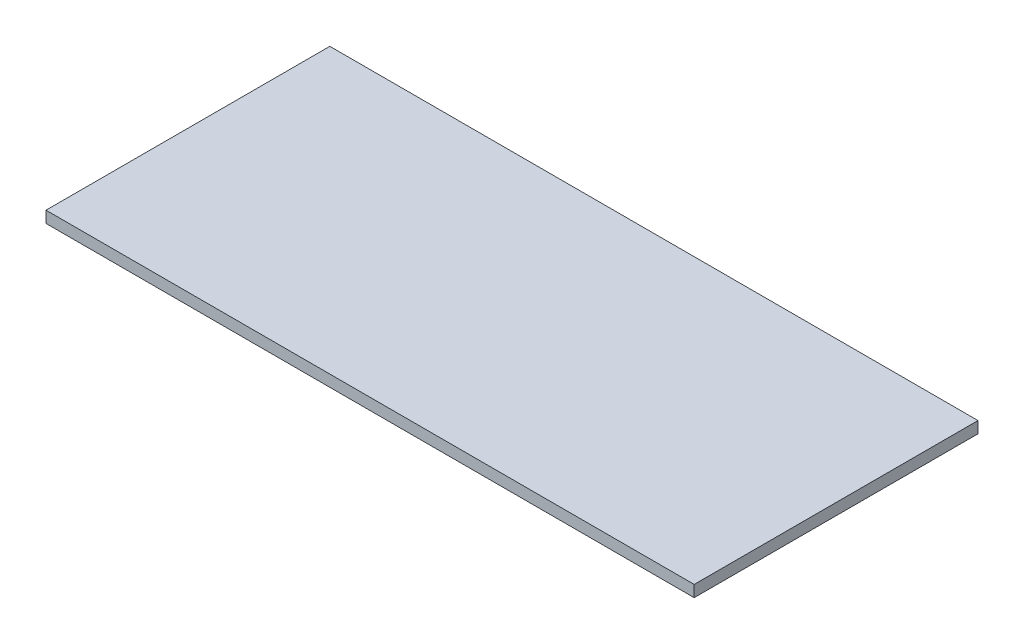
ISO-10303-21;
HEADER;
FILE_DESCRIPTION(('STEP AP214'),'2;1');
FILE_NAME('part.step','',(''),(''),'','','');
FILE_SCHEMA(('AUTOMOTIVE_DESIGN { 1 0 10303 214 1 1 1 1 }'));
ENDSEC;
DATA;
#1=APPLICATION_CONTEXT('core data for automotive mechanical design processes');
#2=APPLICATION_PROTOCOL_DEFINITION('international standard','automotive_design',2000,#1);
#3=PRODUCT_CONTEXT('',#1,'mechanical');
#4=PRODUCT('Part','Part','',(#3));
#5=PRODUCT_RELATED_PRODUCT_CATEGORY('part','',(#4));
#6=PRODUCT_DEFINITION_FORMATION('','',#4);
#7=PRODUCT_DEFINITION_CONTEXT('part definition',#1,'design');
#8=PRODUCT_DEFINITION('design','',#6,#7);
#9=PRODUCT_DEFINITION_SHAPE('','',#8);
#10=(LENGTH_UNIT() NAMED_UNIT(*) SI_UNIT(.MILLI.,.METRE.));
#11=(NAMED_UNIT(*) PLANE_ANGLE_UNIT() SI_UNIT($,.RADIAN.));
#12=(NAMED_UNIT(*) SI_UNIT($,.STERADIAN.) SOLID_ANGLE_UNIT());
#13=UNCERTAINTY_MEASURE_WITH_UNIT(LENGTH_MEASURE(1.E-05),#10,'distance_accuracy_value','');
#14=(GEOMETRIC_REPRESENTATION_CONTEXT(3) GLOBAL_UNCERTAINTY_ASSIGNED_CONTEXT((#13)) GLOBAL_UNIT_ASSIGNED_CONTEXT((#10,
#11,#12)) REPRESENTATION_CONTEXT('',''));
#15=CARTESIAN_POINT('',(0.,0.,0.));
#16=DIRECTION('',(0.,0.,1.));
#17=DIRECTION('',(1.,0.,0.));
#18=AXIS2_PLACEMENT_3D('',#15,#16,#17);
#19=CARTESIAN_POINT('',(0.,1.5,0.));
#20=DIRECTION('',(1.,0.,0.));
#21=DIRECTION('',(0.,0.,-1.));
#22=AXIS2_PLACEMENT_3D('',#19,#20,#21);
#23=PLANE('',#22);
#24=DIRECTION('',(0.,0.,1.));
#25=VECTOR('',#24,1.);
#26=CARTESIAN_POINT('',(0.,0.,0.));
#27=LINE('',#26,#25);
#28=CARTESIAN_POINT('',(0.,0.,0.));
#29=VERTEX_POINT('',#28);
#30=CARTESIAN_POINT('',(0.,0.,37.));
#31=VERTEX_POINT('',#30);
#32=EDGE_CURVE('E102',#29,#31,#27,.T.);
#33=ORIENTED_EDGE('',*,*,#32,.T.);
#34=DIRECTION('',(0.,-1.,0.));
#35=VECTOR('',#34,1.);
#36=CARTESIAN_POINT('',(0.,1.5,37.));
#37=LINE('',#36,#35);
#38=CARTESIAN_POINT('',(0.,1.5,37.));
#39=VERTEX_POINT('',#38);
#40=EDGE_CURVE('E11',#39,#31,#37,.T.);
#41=ORIENTED_EDGE('',*,*,#40,.F.);
#42=DIRECTION('',(0.,0.,1.));
#43=VECTOR('',#42,1.);
#44=CARTESIAN_POINT('',(0.,1.5,0.));
#45=LINE('',#44,#43);
#46=CARTESIAN_POINT('',(0.,1.5,0.));
#47=VERTEX_POINT('',#46);
#48=EDGE_CURVE('E90',#47,#39,#45,.T.);
#49=ORIENTED_EDGE('',*,*,#48,.F.);
#50=DIRECTION('',(0.,-1.,0.));
#51=VECTOR('',#50,1.);
#52=CARTESIAN_POINT('',(0.,1.5,0.));
#53=LINE('',#52,#51);
#54=EDGE_CURVE('E98',#47,#29,#53,.T.);
#55=ORIENTED_EDGE('',*,*,#54,.T.);
#56=EDGE_LOOP('',(#33,#41,#49,#55));
#57=FACE_BOUND('',#56,.T.);
#58=ADVANCED_FACE('F39',(#57),#23,.F.);
#59=CARTESIAN_POINT('',(0.,1.5,37.));
#60=DIRECTION('',(0.,0.,-1.));
#61=DIRECTION('',(-1.,0.,0.));
#62=AXIS2_PLACEMENT_3D('',#59,#60,#61);
#63=PLANE('',#62);
#64=DIRECTION('',(1.,0.,0.));
#65=VECTOR('',#64,1.);
#66=CARTESIAN_POINT('',(0.,0.,37.));
#67=LINE('',#66,#65);
#68=CARTESIAN_POINT('',(84.5,0.,37.));
#69=VERTEX_POINT('',#68);
#70=EDGE_CURVE('E94',#31,#69,#67,.T.);
#71=ORIENTED_EDGE('',*,*,#70,.T.);
#72=DIRECTION('',(0.,-1.,0.));
#73=VECTOR('',#72,1.);
#74=CARTESIAN_POINT('',(84.5,1.5,37.));
#75=LINE('',#74,#73);
#76=CARTESIAN_POINT('',(84.5,1.5,37.));
#77=VERTEX_POINT('',#76);
#78=EDGE_CURVE('E47',#77,#69,#75,.T.);
#79=ORIENTED_EDGE('',*,*,#78,.F.);
#80=DIRECTION('',(1.,0.,0.));
#81=VECTOR('',#80,1.);
#82=CARTESIAN_POINT('',(0.,1.5,37.));
#83=LINE('',#82,#81);
#84=EDGE_CURVE('E85',#39,#77,#83,.T.);
#85=ORIENTED_EDGE('',*,*,#84,.F.);
#86=ORIENTED_EDGE('',*,*,#40,.T.);
#87=EDGE_LOOP('',(#71,#79,#85,#86));
#88=FACE_BOUND('',#87,.T.);
#89=ADVANCED_FACE('F93',(#88),#63,.F.);
#90=CARTESIAN_POINT('',(84.5,1.5,0.));
#91=DIRECTION('',(-1.,0.,0.));
#92=DIRECTION('',(0.,0.,1.));
#93=AXIS2_PLACEMENT_3D('',#90,#91,#92);
#94=PLANE('',#93);
#95=DIRECTION('',(0.,0.,-1.));
#96=VECTOR('',#95,1.);
#97=CARTESIAN_POINT('',(84.5,0.,0.));
#98=LINE('',#97,#96);
#99=CARTESIAN_POINT('',(84.5,0.,0.));
#100=VERTEX_POINT('',#99);
#101=EDGE_CURVE('E72',#69,#100,#98,.T.);
#102=ORIENTED_EDGE('',*,*,#101,.T.);
#103=DIRECTION('',(0.,-1.,0.));
#104=VECTOR('',#103,1.);
#105=CARTESIAN_POINT('',(84.5,1.5,0.));
#106=LINE('',#105,#104);
#107=CARTESIAN_POINT('',(84.5,1.5,0.));
#108=VERTEX_POINT('',#107);
#109=EDGE_CURVE('E95',#108,#100,#106,.T.);
#110=ORIENTED_EDGE('',*,*,#109,.F.);
#111=DIRECTION('',(0.,0.,-1.));
#112=VECTOR('',#111,1.);
#113=CARTESIAN_POINT('',(84.5,1.5,0.));
#114=LINE('',#113,#112);
#115=EDGE_CURVE('E88',#77,#108,#114,.T.);
#116=ORIENTED_EDGE('',*,*,#115,.F.);
#117=ORIENTED_EDGE('',*,*,#78,.T.);
#118=EDGE_LOOP('',(#102,#110,#116,#117));
#119=FACE_BOUND('',#118,.T.);
#120=ADVANCED_FACE('F96',(#119),#94,.F.);
#121=CARTESIAN_POINT('',(0.,1.5,0.));
#122=DIRECTION('',(0.,0.,1.));
#123=DIRECTION('',(1.,0.,0.));
#124=AXIS2_PLACEMENT_3D('',#121,#122,#123);
#125=PLANE('',#124);
#126=DIRECTION('',(-1.,0.,0.));
#127=VECTOR('',#126,1.);
#128=CARTESIAN_POINT('',(0.,0.,0.));
#129=LINE('',#128,#127);
#130=EDGE_CURVE('E78',#100,#29,#129,.T.);
#131=ORIENTED_EDGE('',*,*,#130,.T.);
#132=ORIENTED_EDGE('',*,*,#54,.F.);
#133=DIRECTION('',(-1.,0.,0.));
#134=VECTOR('',#133,1.);
#135=CARTESIAN_POINT('',(0.,1.5,0.));
#136=LINE('',#135,#134);
#137=EDGE_CURVE('E55',#108,#47,#136,.T.);
#138=ORIENTED_EDGE('',*,*,#137,.F.);
#139=ORIENTED_EDGE('',*,*,#109,.T.);
#140=EDGE_LOOP('',(#131,#132,#138,#139));
#141=FACE_BOUND('',#140,.T.);
#142=ADVANCED_FACE('F109',(#141),#125,.F.);
#143=CARTESIAN_POINT('',(0.,1.5,0.));
#144=DIRECTION('',(0.,1.,0.));
#145=DIRECTION('',(0.,0.,1.));
#146=AXIS2_PLACEMENT_3D('',#143,#144,#145);
#147=PLANE('',#146);
#148=ORIENTED_EDGE('',*,*,#48,.T.);
#149=ORIENTED_EDGE('',*,*,#84,.T.);
#150=ORIENTED_EDGE('',*,*,#115,.T.);
#151=ORIENTED_EDGE('',*,*,#137,.T.);
#152=EDGE_LOOP('',(#148,#149,#150,#151));
#153=FACE_BOUND('',#152,.T.);
#154=ADVANCED_FACE('F86',(#153),#147,.T.);
#155=CARTESIAN_POINT('',(0.,0.,0.));
#156=DIRECTION('',(0.,1.,0.));
#157=DIRECTION('',(0.,0.,1.));
#158=AXIS2_PLACEMENT_3D('',#155,#156,#157);
#159=PLANE('',#158);
#160=ORIENTED_EDGE('',*,*,#32,.F.);
#161=ORIENTED_EDGE('',*,*,#130,.F.);
#162=ORIENTED_EDGE('',*,*,#101,.F.);
#163=ORIENTED_EDGE('',*,*,#70,.F.);
#164=EDGE_LOOP('',(#160,#161,#162,#163));
#165=FACE_BOUND('',#164,.T.);
#166=ADVANCED_FACE('F112',(#165),#159,.F.);
#167=CLOSED_SHELL('',(#58,#89,#120,#142,#154,#166));
#168=MANIFOLD_SOLID_BREP('B2',#167);
#169=ADVANCED_BREP_SHAPE_REPRESENTATION('',(#18,#168),#14);
#170=SHAPE_DEFINITION_REPRESENTATION(#9,#169);
ENDSEC;
END-ISO-10303-21;
